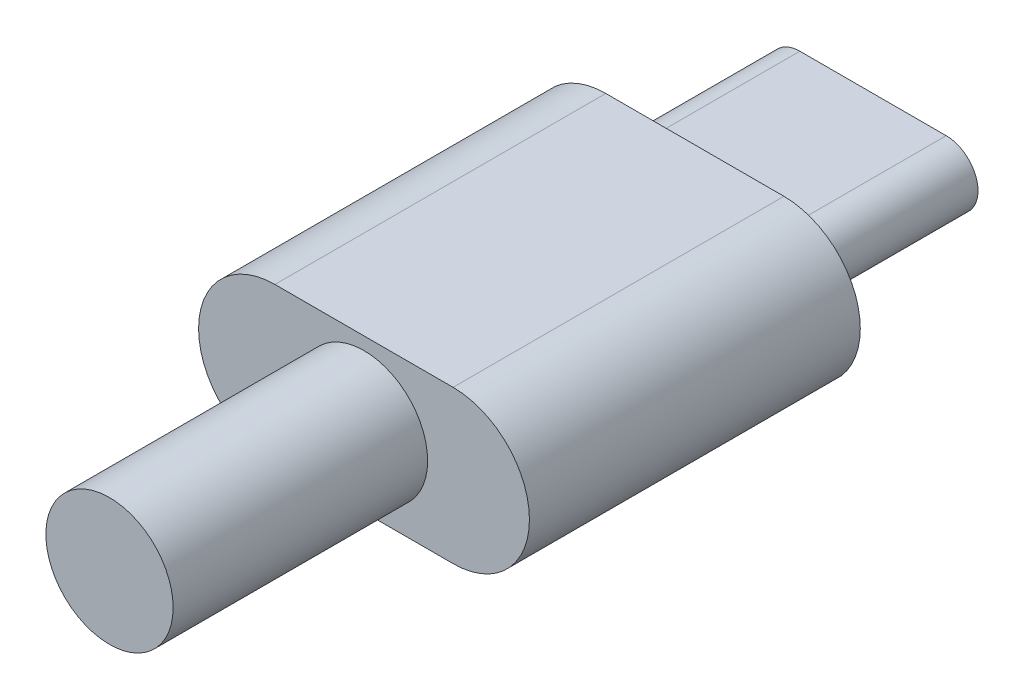
ISO-10303-21;
HEADER;
FILE_DESCRIPTION(('STEP AP214'),'2;1');
FILE_NAME('part.step','',(''),(''),'','','');
FILE_SCHEMA(('AUTOMOTIVE_DESIGN { 1 0 10303 214 1 1 1 1 }'));
ENDSEC;
DATA;
#1=APPLICATION_CONTEXT('core data for automotive mechanical design processes');
#2=APPLICATION_PROTOCOL_DEFINITION('international standard','automotive_design',2000,#1);
#3=PRODUCT_CONTEXT('',#1,'mechanical');
#4=PRODUCT('Part','Part','',(#3));
#5=PRODUCT_RELATED_PRODUCT_CATEGORY('part','',(#4));
#6=PRODUCT_DEFINITION_FORMATION('','',#4);
#7=PRODUCT_DEFINITION_CONTEXT('part definition',#1,'design');
#8=PRODUCT_DEFINITION('design','',#6,#7);
#9=PRODUCT_DEFINITION_SHAPE('','',#8);
#10=(LENGTH_UNIT() NAMED_UNIT(*) SI_UNIT(.MILLI.,.METRE.));
#11=(NAMED_UNIT(*) PLANE_ANGLE_UNIT() SI_UNIT($,.RADIAN.));
#12=(NAMED_UNIT(*) SI_UNIT($,.STERADIAN.) SOLID_ANGLE_UNIT());
#13=UNCERTAINTY_MEASURE_WITH_UNIT(LENGTH_MEASURE(1.E-05),#10,'distance_accuracy_value','');
#14=(GEOMETRIC_REPRESENTATION_CONTEXT(3) GLOBAL_UNCERTAINTY_ASSIGNED_CONTEXT((#13)) GLOBAL_UNIT_ASSIGNED_CONTEXT((#10,
#11,#12)) REPRESENTATION_CONTEXT('',''));
#15=CARTESIAN_POINT('',(0.,0.,0.));
#16=DIRECTION('',(0.,0.,1.));
#17=DIRECTION('',(1.,0.,0.));
#18=AXIS2_PLACEMENT_3D('',#15,#16,#17);
#19=CARTESIAN_POINT('',(-2.875,0.,7.));
#20=DIRECTION('',(0.,0.,-1.));
#21=DIRECTION('',(-1.,0.,0.));
#22=AXIS2_PLACEMENT_3D('',#19,#20,#21);
#23=CYLINDRICAL_SURFACE('',#22,1.25);
#24=CARTESIAN_POINT('',(-2.875,0.,0.));
#25=DIRECTION('',(0.,0.,1.));
#26=DIRECTION('',(1.,0.,0.));
#27=AXIS2_PLACEMENT_3D('',#24,#25,#26);
#28=CIRCLE('',#27,1.25);
#29=CARTESIAN_POINT('',(-2.875,1.25,0.));
#30=VERTEX_POINT('',#29);
#31=CARTESIAN_POINT('',(-2.875,-1.25,0.));
#32=VERTEX_POINT('',#31);
#33=EDGE_CURVE('E132',#30,#32,#28,.T.);
#34=ORIENTED_EDGE('',*,*,#33,.T.);
#35=DIRECTION('',(0.,0.,-1.));
#36=VECTOR('',#35,1.);
#37=CARTESIAN_POINT('',(-2.875,-1.25,7.));
#38=LINE('',#37,#36);
#39=CARTESIAN_POINT('',(-2.875,-1.25,7.));
#40=VERTEX_POINT('',#39);
#41=EDGE_CURVE('E35',#40,#32,#38,.T.);
#42=ORIENTED_EDGE('',*,*,#41,.F.);
#43=CARTESIAN_POINT('',(-2.875,0.,7.));
#44=DIRECTION('',(0.,0.,1.));
#45=DIRECTION('',(1.,0.,0.));
#46=AXIS2_PLACEMENT_3D('',#43,#44,#45);
#47=CIRCLE('',#46,1.25);
#48=CARTESIAN_POINT('',(-2.875,1.25,7.));
#49=VERTEX_POINT('',#48);
#50=EDGE_CURVE('E141',#49,#40,#47,.T.);
#51=ORIENTED_EDGE('',*,*,#50,.F.);
#52=DIRECTION('',(0.,0.,-1.));
#53=VECTOR('',#52,1.);
#54=CARTESIAN_POINT('',(-2.875,1.25,7.));
#55=LINE('',#54,#53);
#56=EDGE_CURVE('E150',#49,#30,#55,.T.);
#57=ORIENTED_EDGE('',*,*,#56,.T.);
#58=EDGE_LOOP('',(#34,#42,#51,#57));
#59=FACE_BOUND('',#58,.T.);
#60=ADVANCED_FACE('F32',(#59),#23,.T.);
#61=CARTESIAN_POINT('',(-2.875,-1.25,7.));
#62=DIRECTION('',(0.,1.,0.));
#63=DIRECTION('',(0.,0.,1.));
#64=AXIS2_PLACEMENT_3D('',#61,#62,#63);
#65=PLANE('',#64);
#66=DIRECTION('',(1.,0.,0.));
#67=VECTOR('',#66,1.);
#68=CARTESIAN_POINT('',(-2.875,-1.25,0.));
#69=LINE('',#68,#67);
#70=CARTESIAN_POINT('',(2.875,-1.25,0.));
#71=VERTEX_POINT('',#70);
#72=EDGE_CURVE('E135',#32,#71,#69,.T.);
#73=ORIENTED_EDGE('',*,*,#72,.T.);
#74=DIRECTION('',(0.,0.,-1.));
#75=VECTOR('',#74,1.);
#76=CARTESIAN_POINT('',(2.875,-1.25,7.));
#77=LINE('',#76,#75);
#78=CARTESIAN_POINT('',(2.875,-1.25,7.));
#79=VERTEX_POINT('',#78);
#80=EDGE_CURVE('E156',#79,#71,#77,.T.);
#81=ORIENTED_EDGE('',*,*,#80,.F.);
#82=DIRECTION('',(1.,0.,0.));
#83=VECTOR('',#82,1.);
#84=CARTESIAN_POINT('',(-2.875,-1.25,7.));
#85=LINE('',#84,#83);
#86=EDGE_CURVE('E76',#40,#79,#85,.T.);
#87=ORIENTED_EDGE('',*,*,#86,.F.);
#88=ORIENTED_EDGE('',*,*,#41,.T.);
#89=EDGE_LOOP('',(#73,#81,#87,#88));
#90=FACE_BOUND('',#89,.T.);
#91=ADVANCED_FACE('F157',(#90),#65,.F.);
#92=CARTESIAN_POINT('',(2.875,0.,7.));
#93=DIRECTION('',(0.,0.,-1.));
#94=DIRECTION('',(-1.,0.,0.));
#95=AXIS2_PLACEMENT_3D('',#92,#93,#94);
#96=CYLINDRICAL_SURFACE('',#95,1.25);
#97=CARTESIAN_POINT('',(2.875,0.,0.));
#98=DIRECTION('',(0.,0.,1.));
#99=DIRECTION('',(1.,0.,0.));
#100=AXIS2_PLACEMENT_3D('',#97,#98,#99);
#101=CIRCLE('',#100,1.25);
#102=CARTESIAN_POINT('',(2.875,1.25,0.));
#103=VERTEX_POINT('',#102);
#104=EDGE_CURVE('E65',#71,#103,#101,.T.);
#105=ORIENTED_EDGE('',*,*,#104,.T.);
#106=DIRECTION('',(0.,0.,-1.));
#107=VECTOR('',#106,1.);
#108=CARTESIAN_POINT('',(2.875,1.25,7.));
#109=LINE('',#108,#107);
#110=CARTESIAN_POINT('',(2.875,1.25,7.));
#111=VERTEX_POINT('',#110);
#112=EDGE_CURVE('E49',#111,#103,#109,.T.);
#113=ORIENTED_EDGE('',*,*,#112,.F.);
#114=CARTESIAN_POINT('',(2.875,0.,7.));
#115=DIRECTION('',(0.,0.,1.));
#116=DIRECTION('',(1.,0.,0.));
#117=AXIS2_PLACEMENT_3D('',#114,#115,#116);
#118=CIRCLE('',#117,1.25);
#119=EDGE_CURVE('E145',#79,#111,#118,.T.);
#120=ORIENTED_EDGE('',*,*,#119,.F.);
#121=ORIENTED_EDGE('',*,*,#80,.T.);
#122=EDGE_LOOP('',(#105,#113,#120,#121));
#123=FACE_BOUND('',#122,.T.);
#124=ADVANCED_FACE('F172',(#123),#96,.T.);
#125=CARTESIAN_POINT('',(-2.875,1.25,7.));
#126=DIRECTION('',(0.,-1.,0.));
#127=DIRECTION('',(0.,0.,-1.));
#128=AXIS2_PLACEMENT_3D('',#125,#126,#127);
#129=PLANE('',#128);
#130=DIRECTION('',(-1.,0.,0.));
#131=VECTOR('',#130,1.);
#132=CARTESIAN_POINT('',(-2.875,1.25,0.));
#133=LINE('',#132,#131);
#134=EDGE_CURVE('E70',#103,#30,#133,.T.);
#135=ORIENTED_EDGE('',*,*,#134,.T.);
#136=ORIENTED_EDGE('',*,*,#56,.F.);
#137=DIRECTION('',(-1.,0.,0.));
#138=VECTOR('',#137,1.);
#139=CARTESIAN_POINT('',(-2.875,1.25,7.));
#140=LINE('',#139,#138);
#141=EDGE_CURVE('E148',#111,#49,#140,.T.);
#142=ORIENTED_EDGE('',*,*,#141,.F.);
#143=ORIENTED_EDGE('',*,*,#112,.T.);
#144=EDGE_LOOP('',(#135,#136,#142,#143));
#145=FACE_BOUND('',#144,.T.);
#146=ADVANCED_FACE('F164',(#145),#129,.F.);
#147=CARTESIAN_POINT('',(-2.875,0.,0.));
#148=DIRECTION('',(0.,0.,1.));
#149=DIRECTION('',(1.,0.,0.));
#150=AXIS2_PLACEMENT_3D('',#147,#148,#149);
#151=PLANE('',#150);
#152=ORIENTED_EDGE('',*,*,#33,.F.);
#153=ORIENTED_EDGE('',*,*,#134,.F.);
#154=ORIENTED_EDGE('',*,*,#104,.F.);
#155=ORIENTED_EDGE('',*,*,#72,.F.);
#156=EDGE_LOOP('',(#152,#153,#154,#155));
#157=FACE_BOUND('',#156,.T.);
#158=ADVANCED_FACE('F161',(#157),#151,.F.);
#159=CARTESIAN_POINT('',(-3.5,0.,7.));
#160=DIRECTION('',(0.,0.,1.));
#161=DIRECTION('',(1.,0.,0.));
#162=AXIS2_PLACEMENT_3D('',#159,#160,#161);
#163=PLANE('',#162);
#164=CARTESIAN_POINT('',(-3.5,0.,7.));
#165=DIRECTION('',(0.,0.,1.));
#166=DIRECTION('',(1.,0.,0.));
#167=AXIS2_PLACEMENT_3D('',#164,#165,#166);
#168=CIRCLE('',#167,3.);
#169=CARTESIAN_POINT('',(-3.5,3.,7.));
#170=VERTEX_POINT('',#169);
#171=CARTESIAN_POINT('',(-3.5,-3.,7.));
#172=VERTEX_POINT('',#171);
#173=EDGE_CURVE('E131',#170,#172,#168,.T.);
#174=ORIENTED_EDGE('',*,*,#173,.F.);
#175=DIRECTION('',(-1.,0.,0.));
#176=VECTOR('',#175,1.);
#177=CARTESIAN_POINT('',(-3.5,3.,7.));
#178=LINE('',#177,#176);
#179=CARTESIAN_POINT('',(3.5,3.,7.));
#180=VERTEX_POINT('',#179);
#181=EDGE_CURVE('E127',#180,#170,#178,.T.);
#182=ORIENTED_EDGE('',*,*,#181,.F.);
#183=CARTESIAN_POINT('',(3.5,0.,7.));
#184=DIRECTION('',(0.,0.,1.));
#185=DIRECTION('',(1.,0.,0.));
#186=AXIS2_PLACEMENT_3D('',#183,#184,#185);
#187=CIRCLE('',#186,3.);
#188=CARTESIAN_POINT('',(3.5,-3.,7.));
#189=VERTEX_POINT('',#188);
#190=EDGE_CURVE('E275',#189,#180,#187,.T.);
#191=ORIENTED_EDGE('',*,*,#190,.F.);
#192=DIRECTION('',(1.,0.,0.));
#193=VECTOR('',#192,1.);
#194=CARTESIAN_POINT('',(-3.5,-3.,7.));
#195=LINE('',#194,#193);
#196=EDGE_CURVE('E268',#172,#189,#195,.T.);
#197=ORIENTED_EDGE('',*,*,#196,.F.);
#198=EDGE_LOOP('',(#174,#182,#191,#197));
#199=FACE_BOUND('',#198,.T.);
#200=ORIENTED_EDGE('',*,*,#141,.T.);
#201=ORIENTED_EDGE('',*,*,#50,.T.);
#202=ORIENTED_EDGE('',*,*,#86,.T.);
#203=ORIENTED_EDGE('',*,*,#119,.T.);
#204=EDGE_LOOP('',(#200,#201,#202,#203));
#205=FACE_BOUND('',#204,.T.);
#206=ADVANCED_FACE('F163',(#199,#205),#163,.F.);
#207=CARTESIAN_POINT('',(-3.5,0.,20.));
#208=DIRECTION('',(0.,0.,-1.));
#209=DIRECTION('',(-1.,0.,0.));
#210=AXIS2_PLACEMENT_3D('',#207,#208,#209);
#211=CYLINDRICAL_SURFACE('',#210,3.);
#212=ORIENTED_EDGE('',*,*,#173,.T.);
#213=DIRECTION('',(0.,0.,-1.));
#214=VECTOR('',#213,1.);
#215=CARTESIAN_POINT('',(-3.5,-3.,20.));
#216=LINE('',#215,#214);
#217=CARTESIAN_POINT('',(-3.5,-3.,20.));
#218=VERTEX_POINT('',#217);
#219=EDGE_CURVE('E111',#218,#172,#216,.T.);
#220=ORIENTED_EDGE('',*,*,#219,.F.);
#221=CARTESIAN_POINT('',(-3.5,0.,20.));
#222=DIRECTION('',(0.,0.,1.));
#223=DIRECTION('',(1.,0.,0.));
#224=AXIS2_PLACEMENT_3D('',#221,#222,#223);
#225=CIRCLE('',#224,3.);
#226=CARTESIAN_POINT('',(-3.5,3.,20.));
#227=VERTEX_POINT('',#226);
#228=EDGE_CURVE('E118',#227,#218,#225,.T.);
#229=ORIENTED_EDGE('',*,*,#228,.F.);
#230=DIRECTION('',(0.,0.,-1.));
#231=VECTOR('',#230,1.);
#232=CARTESIAN_POINT('',(-3.5,3.,20.));
#233=LINE('',#232,#231);
#234=EDGE_CURVE('E272',#227,#170,#233,.T.);
#235=ORIENTED_EDGE('',*,*,#234,.T.);
#236=EDGE_LOOP('',(#212,#220,#229,#235));
#237=FACE_BOUND('',#236,.T.);
#238=ADVANCED_FACE('F129',(#237),#211,.T.);
#239=CARTESIAN_POINT('',(-3.5,-3.,20.));
#240=DIRECTION('',(0.,1.,0.));
#241=DIRECTION('',(0.,0.,1.));
#242=AXIS2_PLACEMENT_3D('',#239,#240,#241);
#243=PLANE('',#242);
#244=ORIENTED_EDGE('',*,*,#196,.T.);
#245=DIRECTION('',(0.,0.,-1.));
#246=VECTOR('',#245,1.);
#247=CARTESIAN_POINT('',(3.5,-3.,20.));
#248=LINE('',#247,#246);
#249=CARTESIAN_POINT('',(3.5,-3.,20.));
#250=VERTEX_POINT('',#249);
#251=EDGE_CURVE('E114',#250,#189,#248,.T.);
#252=ORIENTED_EDGE('',*,*,#251,.F.);
#253=DIRECTION('',(1.,0.,0.));
#254=VECTOR('',#253,1.);
#255=CARTESIAN_POINT('',(-3.5,-3.,20.));
#256=LINE('',#255,#254);
#257=EDGE_CURVE('E107',#218,#250,#256,.T.);
#258=ORIENTED_EDGE('',*,*,#257,.F.);
#259=ORIENTED_EDGE('',*,*,#219,.T.);
#260=EDGE_LOOP('',(#244,#252,#258,#259));
#261=FACE_BOUND('',#260,.T.);
#262=ADVANCED_FACE('F109',(#261),#243,.F.);
#263=CARTESIAN_POINT('',(3.5,0.,20.));
#264=DIRECTION('',(0.,0.,-1.));
#265=DIRECTION('',(-1.,0.,0.));
#266=AXIS2_PLACEMENT_3D('',#263,#264,#265);
#267=CYLINDRICAL_SURFACE('',#266,3.);
#268=ORIENTED_EDGE('',*,*,#190,.T.);
#269=DIRECTION('',(0.,0.,-1.));
#270=VECTOR('',#269,1.);
#271=CARTESIAN_POINT('',(3.5,3.,20.));
#272=LINE('',#271,#270);
#273=CARTESIAN_POINT('',(3.5,3.,20.));
#274=VERTEX_POINT('',#273);
#275=EDGE_CURVE('E137',#274,#180,#272,.T.);
#276=ORIENTED_EDGE('',*,*,#275,.F.);
#277=CARTESIAN_POINT('',(3.5,0.,20.));
#278=DIRECTION('',(0.,0.,1.));
#279=DIRECTION('',(1.,0.,0.));
#280=AXIS2_PLACEMENT_3D('',#277,#278,#279);
#281=CIRCLE('',#280,3.);
#282=EDGE_CURVE('E117',#250,#274,#281,.T.);
#283=ORIENTED_EDGE('',*,*,#282,.F.);
#284=ORIENTED_EDGE('',*,*,#251,.T.);
#285=EDGE_LOOP('',(#268,#276,#283,#284));
#286=FACE_BOUND('',#285,.T.);
#287=ADVANCED_FACE('F212',(#286),#267,.T.);
#288=CARTESIAN_POINT('',(-3.5,3.,20.));
#289=DIRECTION('',(0.,-1.,0.));
#290=DIRECTION('',(0.,0.,-1.));
#291=AXIS2_PLACEMENT_3D('',#288,#289,#290);
#292=PLANE('',#291);
#293=ORIENTED_EDGE('',*,*,#181,.T.);
#294=ORIENTED_EDGE('',*,*,#234,.F.);
#295=DIRECTION('',(-1.,0.,0.));
#296=VECTOR('',#295,1.);
#297=CARTESIAN_POINT('',(-3.5,3.,20.));
#298=LINE('',#297,#296);
#299=EDGE_CURVE('E123',#274,#227,#298,.T.);
#300=ORIENTED_EDGE('',*,*,#299,.F.);
#301=ORIENTED_EDGE('',*,*,#275,.T.);
#302=EDGE_LOOP('',(#293,#294,#300,#301));
#303=FACE_BOUND('',#302,.T.);
#304=ADVANCED_FACE('F221',(#303),#292,.F.);
#305=CARTESIAN_POINT('',(-3.5,0.,20.));
#306=DIRECTION('',(0.,0.,1.));
#307=DIRECTION('',(1.,0.,0.));
#308=AXIS2_PLACEMENT_3D('',#305,#306,#307);
#309=PLANE('',#308);
#310=CARTESIAN_POINT('',(0.,0.,20.));
#311=DIRECTION('',(0.,0.,1.));
#312=DIRECTION('',(1.,0.,0.));
#313=AXIS2_PLACEMENT_3D('',#310,#311,#312);
#314=CIRCLE('',#313,2.5);
#315=CARTESIAN_POINT('',(2.5,0.,20.));
#316=VERTEX_POINT('',#315);
#317=EDGE_CURVE('E11',#316,#316,#314,.T.);
#318=ORIENTED_EDGE('',*,*,#317,.F.);
#319=EDGE_LOOP('',(#318));
#320=FACE_BOUND('',#319,.T.);
#321=ORIENTED_EDGE('',*,*,#228,.T.);
#322=ORIENTED_EDGE('',*,*,#257,.T.);
#323=ORIENTED_EDGE('',*,*,#282,.T.);
#324=ORIENTED_EDGE('',*,*,#299,.T.);
#325=EDGE_LOOP('',(#321,#322,#323,#324));
#326=FACE_BOUND('',#325,.T.);
#327=ADVANCED_FACE('F121',(#320,#326),#309,.T.);
#328=CARTESIAN_POINT('',(0.,0.,30.));
#329=DIRECTION('',(0.,0.,-1.));
#330=DIRECTION('',(-1.,0.,0.));
#331=AXIS2_PLACEMENT_3D('',#328,#329,#330);
#332=CYLINDRICAL_SURFACE('',#331,2.5);
#333=CARTESIAN_POINT('',(0.,0.,30.));
#334=DIRECTION('',(0.,0.,1.));
#335=DIRECTION('',(1.,0.,0.));
#336=AXIS2_PLACEMENT_3D('',#333,#334,#335);
#337=CIRCLE('',#336,2.5);
#338=CARTESIAN_POINT('',(2.5,0.,30.));
#339=VERTEX_POINT('',#338);
#340=EDGE_CURVE('E266',#339,#339,#337,.T.);
#341=ORIENTED_EDGE('',*,*,#340,.F.);
#342=EDGE_LOOP('',(#341));
#343=FACE_BOUND('',#342,.T.);
#344=ORIENTED_EDGE('',*,*,#317,.T.);
#345=EDGE_LOOP('',(#344));
#346=FACE_BOUND('',#345,.T.);
#347=ADVANCED_FACE('F240',(#343,#346),#332,.T.);
#348=CARTESIAN_POINT('',(0.,0.,30.));
#349=DIRECTION('',(0.,0.,1.));
#350=DIRECTION('',(1.,0.,0.));
#351=AXIS2_PLACEMENT_3D('',#348,#349,#350);
#352=PLANE('',#351);
#353=ORIENTED_EDGE('',*,*,#340,.T.);
#354=EDGE_LOOP('',(#353));
#355=FACE_BOUND('',#354,.T.);
#356=ADVANCED_FACE('F250',(#355),#352,.T.);
#357=CLOSED_SHELL('',(#60,#91,#124,#146,#158,#206,#238,#262,#287,#304,#327,#347,#356));
#358=MANIFOLD_SOLID_BREP('B2',#357);
#359=ADVANCED_BREP_SHAPE_REPRESENTATION('',(#18,#358),#14);
#360=SHAPE_DEFINITION_REPRESENTATION(#9,#359);
ENDSEC;
END-ISO-10303-21;
